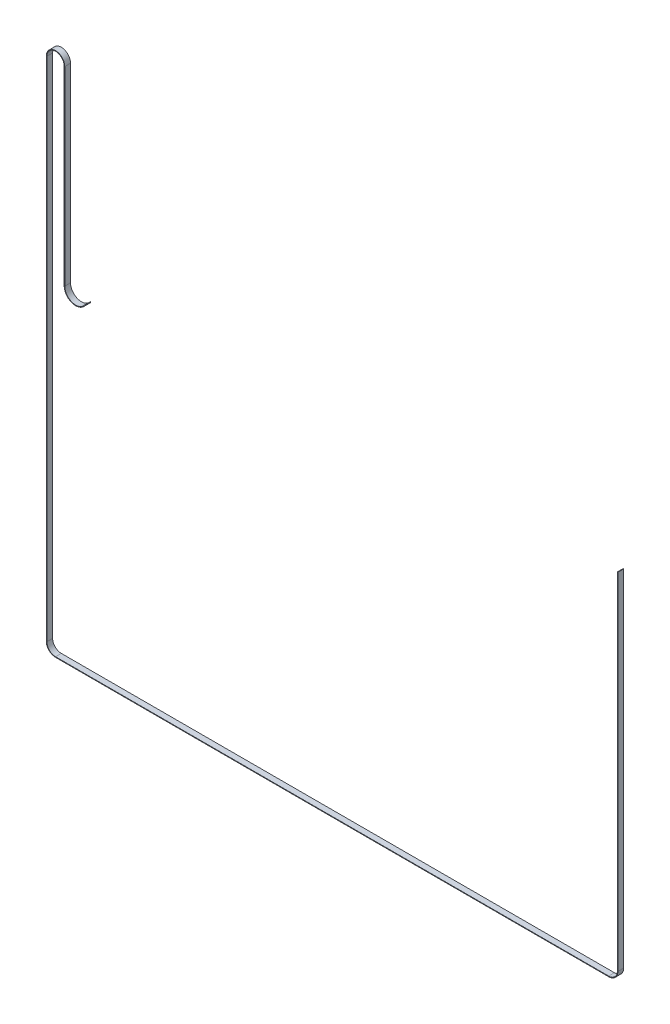
ISO-10303-21;
HEADER;
FILE_DESCRIPTION(('STEP AP214'),'2;1');
FILE_NAME('part.step','',(''),(''),'','','');
FILE_SCHEMA(('AUTOMOTIVE_DESIGN { 1 0 10303 214 1 1 1 1 }'));
ENDSEC;
DATA;
#1=APPLICATION_CONTEXT('core data for automotive mechanical design processes');
#2=APPLICATION_PROTOCOL_DEFINITION('international standard','automotive_design',2000,#1);
#3=PRODUCT_CONTEXT('',#1,'mechanical');
#4=PRODUCT('Part','Part','',(#3));
#5=PRODUCT_RELATED_PRODUCT_CATEGORY('part','',(#4));
#6=PRODUCT_DEFINITION_FORMATION('','',#4);
#7=PRODUCT_DEFINITION_CONTEXT('part definition',#1,'design');
#8=PRODUCT_DEFINITION('design','',#6,#7);
#9=PRODUCT_DEFINITION_SHAPE('','',#8);
#10=(LENGTH_UNIT() NAMED_UNIT(*) SI_UNIT(.MILLI.,.METRE.));
#11=(NAMED_UNIT(*) PLANE_ANGLE_UNIT() SI_UNIT($,.RADIAN.));
#12=(NAMED_UNIT(*) SI_UNIT($,.STERADIAN.) SOLID_ANGLE_UNIT());
#13=UNCERTAINTY_MEASURE_WITH_UNIT(LENGTH_MEASURE(1.E-05),#10,'distance_accuracy_value','');
#14=(GEOMETRIC_REPRESENTATION_CONTEXT(3) GLOBAL_UNCERTAINTY_ASSIGNED_CONTEXT((#13)) GLOBAL_UNIT_ASSIGNED_CONTEXT((#10,
#11,#12)) REPRESENTATION_CONTEXT('',''));
#15=CARTESIAN_POINT('',(0.,0.,0.));
#16=DIRECTION('',(0.,0.,1.));
#17=DIRECTION('',(1.,0.,0.));
#18=AXIS2_PLACEMENT_3D('',#15,#16,#17);
#19=CARTESIAN_POINT('',(-222.5,275.,2.5));
#20=DIRECTION('',(0.,0.,-1.));
#21=DIRECTION('',(-1.,0.,0.));
#22=AXIS2_PLACEMENT_3D('',#19,#20,#21);
#23=CYLINDRICAL_SURFACE('',#22,9.99999999999976);
#24=CARTESIAN_POINT('',(-222.5,275.,-2.5));
#25=DIRECTION('',(0.,0.,1.));
#26=DIRECTION('',(1.,0.,0.));
#27=AXIS2_PLACEMENT_3D('',#24,#25,#26);
#28=CIRCLE('',#27,9.99999999999976);
#29=CARTESIAN_POINT('',(-232.5,275.,-2.5));
#30=VERTEX_POINT('',#29);
#31=CARTESIAN_POINT('',(-214.437599566756,269.084114668621,-2.5));
#32=VERTEX_POINT('',#31);
#33=EDGE_CURVE('E190',#30,#32,#28,.T.);
#34=ORIENTED_EDGE('',*,*,#33,.T.);
#35=DIRECTION('',(0.,0.,-1.));
#36=VECTOR('',#35,1.);
#37=CARTESIAN_POINT('',(-214.437599566756,269.084114668621,2.5));
#38=LINE('',#37,#36);
#39=CARTESIAN_POINT('',(-214.437599566756,269.084114668621,2.5));
#40=VERTEX_POINT('',#39);
#41=EDGE_CURVE('E11',#40,#32,#38,.T.);
#42=ORIENTED_EDGE('',*,*,#41,.F.);
#43=CARTESIAN_POINT('',(-222.5,275.,2.5));
#44=DIRECTION('',(0.,0.,1.));
#45=DIRECTION('',(1.,0.,0.));
#46=AXIS2_PLACEMENT_3D('',#43,#44,#45);
#47=CIRCLE('',#46,9.99999999999976);
#48=CARTESIAN_POINT('',(-232.5,275.,2.5));
#49=VERTEX_POINT('',#48);
#50=EDGE_CURVE('E121',#49,#40,#47,.T.);
#51=ORIENTED_EDGE('',*,*,#50,.F.);
#52=DIRECTION('',(0.,0.,-1.));
#53=VECTOR('',#52,1.);
#54=CARTESIAN_POINT('',(-232.5,275.,2.5));
#55=LINE('',#54,#53);
#56=EDGE_CURVE('E186',#49,#30,#55,.T.);
#57=ORIENTED_EDGE('',*,*,#56,.T.);
#58=EDGE_LOOP('',(#34,#42,#51,#57));
#59=FACE_BOUND('',#58,.T.);
#60=ADVANCED_FACE('F35',(#59),#23,.T.);
#61=CARTESIAN_POINT('',(-214.840719588419,269.37990893519,2.5));
#62=DIRECTION('',(0.591588533137898,0.806240043324412,0.));
#63=DIRECTION('',(-0.806240043324412,0.591588533137898,0.));
#64=AXIS2_PLACEMENT_3D('',#61,#62,#63);
#65=PLANE('',#64);
#66=DIRECTION('',(0.806240043324412,-0.591588533137898,0.));
#67=VECTOR('',#66,1.);
#68=CARTESIAN_POINT('',(-214.840719588419,269.37990893519,-2.5));
#69=LINE('',#68,#67);
#70=CARTESIAN_POINT('',(-214.840719588419,269.37990893519,-2.5));
#71=VERTEX_POINT('',#70);
#72=EDGE_CURVE('E193',#71,#32,#69,.T.);
#73=ORIENTED_EDGE('',*,*,#72,.F.);
#74=DIRECTION('',(0.,0.,-1.));
#75=VECTOR('',#74,1.);
#76=CARTESIAN_POINT('',(-214.840719588419,269.37990893519,2.5));
#77=LINE('',#76,#75);
#78=CARTESIAN_POINT('',(-214.840719588419,269.37990893519,2.5));
#79=VERTEX_POINT('',#78);
#80=EDGE_CURVE('E43',#79,#71,#77,.T.);
#81=ORIENTED_EDGE('',*,*,#80,.F.);
#82=DIRECTION('',(0.806240043324412,-0.591588533137898,0.));
#83=VECTOR('',#82,1.);
#84=CARTESIAN_POINT('',(-214.840719588419,269.37990893519,2.5));
#85=LINE('',#84,#83);
#86=EDGE_CURVE('E285',#79,#40,#85,.T.);
#87=ORIENTED_EDGE('',*,*,#86,.T.);
#88=ORIENTED_EDGE('',*,*,#41,.T.);
#89=EDGE_LOOP('',(#73,#81,#87,#88));
#90=FACE_BOUND('',#89,.T.);
#91=ADVANCED_FACE('F272',(#90),#65,.T.);
#92=CARTESIAN_POINT('',(-222.5,275.,2.5));
#93=DIRECTION('',(0.,0.,-1.));
#94=DIRECTION('',(-1.,0.,0.));
#95=AXIS2_PLACEMENT_3D('',#92,#93,#94);
#96=CYLINDRICAL_SURFACE('',#95,9.49999999999976);
#97=CARTESIAN_POINT('',(-222.5,275.,-2.5));
#98=DIRECTION('',(0.,0.,1.));
#99=DIRECTION('',(1.,0.,0.));
#100=AXIS2_PLACEMENT_3D('',#97,#98,#99);
#101=CIRCLE('',#100,9.49999999999976);
#102=CARTESIAN_POINT('',(-232.,275.,-2.5));
#103=VERTEX_POINT('',#102);
#104=EDGE_CURVE('E196',#103,#71,#101,.T.);
#105=ORIENTED_EDGE('',*,*,#104,.F.);
#106=DIRECTION('',(0.,0.,-1.));
#107=VECTOR('',#106,1.);
#108=CARTESIAN_POINT('',(-232.,275.,2.5));
#109=LINE('',#108,#107);
#110=CARTESIAN_POINT('',(-232.,275.,2.5));
#111=VERTEX_POINT('',#110);
#112=EDGE_CURVE('E262',#111,#103,#109,.T.);
#113=ORIENTED_EDGE('',*,*,#112,.F.);
#114=CARTESIAN_POINT('',(-222.5,275.,2.5));
#115=DIRECTION('',(0.,0.,1.));
#116=DIRECTION('',(1.,0.,0.));
#117=AXIS2_PLACEMENT_3D('',#114,#115,#116);
#118=CIRCLE('',#117,9.49999999999976);
#119=EDGE_CURVE('E269',#111,#79,#118,.T.);
#120=ORIENTED_EDGE('',*,*,#119,.T.);
#121=ORIENTED_EDGE('',*,*,#80,.T.);
#122=EDGE_LOOP('',(#105,#113,#120,#121));
#123=FACE_BOUND('',#122,.T.);
#124=ADVANCED_FACE('F267',(#123),#96,.F.);
#125=CARTESIAN_POINT('',(-232.,440.,2.5));
#126=DIRECTION('',(1.,0.,0.));
#127=DIRECTION('',(0.,1.,0.));
#128=AXIS2_PLACEMENT_3D('',#125,#126,#127);
#129=PLANE('',#128);
#130=DIRECTION('',(0.,-1.,0.));
#131=VECTOR('',#130,1.);
#132=CARTESIAN_POINT('',(-232.,440.,-2.5));
#133=LINE('',#132,#131);
#134=CARTESIAN_POINT('',(-232.,440.,-2.5));
#135=VERTEX_POINT('',#134);
#136=EDGE_CURVE('E199',#135,#103,#133,.T.);
#137=ORIENTED_EDGE('',*,*,#136,.F.);
#138=DIRECTION('',(0.,0.,-1.));
#139=VECTOR('',#138,1.);
#140=CARTESIAN_POINT('',(-232.,440.,2.5));
#141=LINE('',#140,#139);
#142=CARTESIAN_POINT('',(-232.,440.,2.5));
#143=VERTEX_POINT('',#142);
#144=EDGE_CURVE('E260',#143,#135,#141,.T.);
#145=ORIENTED_EDGE('',*,*,#144,.F.);
#146=DIRECTION('',(0.,-1.,0.));
#147=VECTOR('',#146,1.);
#148=CARTESIAN_POINT('',(-232.,440.,2.5));
#149=LINE('',#148,#147);
#150=EDGE_CURVE('E282',#143,#111,#149,.T.);
#151=ORIENTED_EDGE('',*,*,#150,.T.);
#152=ORIENTED_EDGE('',*,*,#112,.T.);
#153=EDGE_LOOP('',(#137,#145,#151,#152));
#154=FACE_BOUND('',#153,.T.);
#155=ADVANCED_FACE('F279',(#154),#129,.T.);
#156=CARTESIAN_POINT('',(-240.,440.,2.5));
#157=DIRECTION('',(0.,0.,-1.));
#158=DIRECTION('',(-1.,0.,0.));
#159=AXIS2_PLACEMENT_3D('',#156,#157,#158);
#160=CYLINDRICAL_SURFACE('',#159,8.00000000000001);
#161=CARTESIAN_POINT('',(-240.,440.,-2.5));
#162=DIRECTION('',(0.,0.,1.));
#163=DIRECTION('',(1.,0.,0.));
#164=AXIS2_PLACEMENT_3D('',#161,#162,#163);
#165=CIRCLE('',#164,8.00000000000001);
#166=CARTESIAN_POINT('',(-248.,440.,-2.5));
#167=VERTEX_POINT('',#166);
#168=EDGE_CURVE('E202',#167,#135,#165,.F.);
#169=ORIENTED_EDGE('',*,*,#168,.F.);
#170=DIRECTION('',(0.,0.,-1.));
#171=VECTOR('',#170,1.);
#172=CARTESIAN_POINT('',(-248.,440.,2.5));
#173=LINE('',#172,#171);
#174=CARTESIAN_POINT('',(-248.,440.,2.5));
#175=VERTEX_POINT('',#174);
#176=EDGE_CURVE('E258',#175,#167,#173,.T.);
#177=ORIENTED_EDGE('',*,*,#176,.F.);
#178=CARTESIAN_POINT('',(-240.,440.,2.5));
#179=DIRECTION('',(0.,0.,1.));
#180=DIRECTION('',(1.,0.,0.));
#181=AXIS2_PLACEMENT_3D('',#178,#179,#180);
#182=CIRCLE('',#181,8.00000000000001);
#183=EDGE_CURVE('E287',#175,#143,#182,.F.);
#184=ORIENTED_EDGE('',*,*,#183,.T.);
#185=ORIENTED_EDGE('',*,*,#144,.T.);
#186=EDGE_LOOP('',(#169,#177,#184,#185));
#187=FACE_BOUND('',#186,.T.);
#188=ADVANCED_FACE('F348',(#187),#160,.T.);
#189=CARTESIAN_POINT('',(-248.,0.,2.5));
#190=DIRECTION('',(-1.,0.,0.));
#191=DIRECTION('',(0.,0.,1.));
#192=AXIS2_PLACEMENT_3D('',#189,#190,#191);
#193=PLANE('',#192);
#194=DIRECTION('',(0.,1.,0.));
#195=VECTOR('',#194,1.);
#196=CARTESIAN_POINT('',(-248.,0.,-2.5));
#197=LINE('',#196,#195);
#198=CARTESIAN_POINT('',(-248.,0.,-2.5));
#199=VERTEX_POINT('',#198);
#200=EDGE_CURVE('E205',#199,#167,#197,.T.);
#201=ORIENTED_EDGE('',*,*,#200,.F.);
#202=DIRECTION('',(0.,0.,-1.));
#203=VECTOR('',#202,1.);
#204=CARTESIAN_POINT('',(-248.,0.,2.5));
#205=LINE('',#204,#203);
#206=CARTESIAN_POINT('',(-248.,0.,2.5));
#207=VERTEX_POINT('',#206);
#208=EDGE_CURVE('E256',#207,#199,#205,.T.);
#209=ORIENTED_EDGE('',*,*,#208,.F.);
#210=DIRECTION('',(0.,1.,0.));
#211=VECTOR('',#210,1.);
#212=CARTESIAN_POINT('',(-248.,0.,2.5));
#213=LINE('',#212,#211);
#214=EDGE_CURVE('E293',#207,#175,#213,.T.);
#215=ORIENTED_EDGE('',*,*,#214,.T.);
#216=ORIENTED_EDGE('',*,*,#176,.T.);
#217=EDGE_LOOP('',(#201,#209,#215,#216));
#218=FACE_BOUND('',#217,.T.);
#219=ADVANCED_FACE('F351',(#218),#193,.T.);
#220=CARTESIAN_POINT('',(-240.,0.,2.5));
#221=DIRECTION('',(0.,0.,-1.));
#222=DIRECTION('',(-1.,0.,0.));
#223=AXIS2_PLACEMENT_3D('',#220,#221,#222);
#224=CYLINDRICAL_SURFACE('',#223,8.);
#225=CARTESIAN_POINT('',(-240.,0.,-2.5));
#226=DIRECTION('',(0.,0.,1.));
#227=DIRECTION('',(1.,0.,0.));
#228=AXIS2_PLACEMENT_3D('',#225,#226,#227);
#229=CIRCLE('',#228,8.);
#230=CARTESIAN_POINT('',(-240.,-8.00000000000002,-2.5));
#231=VERTEX_POINT('',#230);
#232=EDGE_CURVE('E208',#231,#199,#229,.F.);
#233=ORIENTED_EDGE('',*,*,#232,.F.);
#234=DIRECTION('',(0.,0.,-1.));
#235=VECTOR('',#234,1.);
#236=CARTESIAN_POINT('',(-240.,-8.00000000000002,2.5));
#237=LINE('',#236,#235);
#238=CARTESIAN_POINT('',(-240.,-8.00000000000002,2.5));
#239=VERTEX_POINT('',#238);
#240=EDGE_CURVE('E254',#239,#231,#237,.T.);
#241=ORIENTED_EDGE('',*,*,#240,.F.);
#242=CARTESIAN_POINT('',(-240.,0.,2.5));
#243=DIRECTION('',(0.,0.,1.));
#244=DIRECTION('',(1.,0.,0.));
#245=AXIS2_PLACEMENT_3D('',#242,#243,#244);
#246=CIRCLE('',#245,8.);
#247=EDGE_CURVE('E296',#239,#207,#246,.F.);
#248=ORIENTED_EDGE('',*,*,#247,.T.);
#249=ORIENTED_EDGE('',*,*,#208,.T.);
#250=EDGE_LOOP('',(#233,#241,#248,#249));
#251=FACE_BOUND('',#250,.T.);
#252=ADVANCED_FACE('F355',(#251),#224,.T.);
#253=CARTESIAN_POINT('',(240.,-8.00000000000001,2.5));
#254=DIRECTION('',(0.,-1.,0.));
#255=DIRECTION('',(0.,0.,-1.));
#256=AXIS2_PLACEMENT_3D('',#253,#254,#255);
#257=PLANE('',#256);
#258=DIRECTION('',(1.,0.,0.));
#259=VECTOR('',#258,1.);
#260=CARTESIAN_POINT('',(240.,-8.00000000000001,-2.5));
#261=LINE('',#260,#259);
#262=CARTESIAN_POINT('',(240.,-8.00000000000001,-2.5));
#263=VERTEX_POINT('',#262);
#264=EDGE_CURVE('E211',#263,#231,#261,.F.);
#265=ORIENTED_EDGE('',*,*,#264,.F.);
#266=DIRECTION('',(0.,0.,-1.));
#267=VECTOR('',#266,1.);
#268=CARTESIAN_POINT('',(240.,-8.00000000000001,2.5));
#269=LINE('',#268,#267);
#270=CARTESIAN_POINT('',(240.,-8.00000000000001,2.5));
#271=VERTEX_POINT('',#270);
#272=EDGE_CURVE('E252',#271,#263,#269,.T.);
#273=ORIENTED_EDGE('',*,*,#272,.F.);
#274=DIRECTION('',(1.,0.,0.));
#275=VECTOR('',#274,1.);
#276=CARTESIAN_POINT('',(240.,-8.00000000000001,2.5));
#277=LINE('',#276,#275);
#278=EDGE_CURVE('E299',#271,#239,#277,.F.);
#279=ORIENTED_EDGE('',*,*,#278,.T.);
#280=ORIENTED_EDGE('',*,*,#240,.T.);
#281=EDGE_LOOP('',(#265,#273,#279,#280));
#282=FACE_BOUND('',#281,.T.);
#283=ADVANCED_FACE('F359',(#282),#257,.T.);
#284=CARTESIAN_POINT('',(240.,0.,2.5));
#285=DIRECTION('',(0.,0.,-1.));
#286=DIRECTION('',(-1.,0.,0.));
#287=AXIS2_PLACEMENT_3D('',#284,#285,#286);
#288=CYLINDRICAL_SURFACE('',#287,8.00000000000004);
#289=CARTESIAN_POINT('',(240.,0.,-2.5));
#290=DIRECTION('',(0.,0.,1.));
#291=DIRECTION('',(1.,0.,0.));
#292=AXIS2_PLACEMENT_3D('',#289,#290,#291);
#293=CIRCLE('',#292,8.00000000000004);
#294=CARTESIAN_POINT('',(248.,0.,-2.5));
#295=VERTEX_POINT('',#294);
#296=EDGE_CURVE('E214',#295,#263,#293,.F.);
#297=ORIENTED_EDGE('',*,*,#296,.F.);
#298=DIRECTION('',(0.,0.,-1.));
#299=VECTOR('',#298,1.);
#300=CARTESIAN_POINT('',(248.,0.,2.5));
#301=LINE('',#300,#299);
#302=CARTESIAN_POINT('',(248.,0.,2.5));
#303=VERTEX_POINT('',#302);
#304=EDGE_CURVE('E250',#303,#295,#301,.T.);
#305=ORIENTED_EDGE('',*,*,#304,.F.);
#306=CARTESIAN_POINT('',(240.,0.,2.5));
#307=DIRECTION('',(0.,0.,1.));
#308=DIRECTION('',(1.,0.,0.));
#309=AXIS2_PLACEMENT_3D('',#306,#307,#308);
#310=CIRCLE('',#309,8.00000000000004);
#311=EDGE_CURVE('E302',#303,#271,#310,.F.);
#312=ORIENTED_EDGE('',*,*,#311,.T.);
#313=ORIENTED_EDGE('',*,*,#272,.T.);
#314=EDGE_LOOP('',(#297,#305,#312,#313));
#315=FACE_BOUND('',#314,.T.);
#316=ADVANCED_FACE('F363',(#315),#288,.T.);
#317=CARTESIAN_POINT('',(248.,0.,2.5));
#318=DIRECTION('',(1.,0.,0.));
#319=DIRECTION('',(0.,0.,-1.));
#320=AXIS2_PLACEMENT_3D('',#317,#318,#319);
#321=PLANE('',#320);
#322=DIRECTION('',(0.,1.,0.));
#323=VECTOR('',#322,1.);
#324=CARTESIAN_POINT('',(248.,0.,-2.5));
#325=LINE('',#324,#323);
#326=CARTESIAN_POINT('',(248.,300.,-2.5));
#327=VERTEX_POINT('',#326);
#328=EDGE_CURVE('E217',#327,#295,#325,.F.);
#329=ORIENTED_EDGE('',*,*,#328,.F.);
#330=DIRECTION('',(0.,0.,-1.));
#331=VECTOR('',#330,1.);
#332=CARTESIAN_POINT('',(248.,300.,2.5));
#333=LINE('',#332,#331);
#334=CARTESIAN_POINT('',(248.,300.,2.5));
#335=VERTEX_POINT('',#334);
#336=EDGE_CURVE('E248',#335,#327,#333,.T.);
#337=ORIENTED_EDGE('',*,*,#336,.F.);
#338=DIRECTION('',(0.,1.,0.));
#339=VECTOR('',#338,1.);
#340=CARTESIAN_POINT('',(248.,0.,2.5));
#341=LINE('',#340,#339);
#342=EDGE_CURVE('E305',#335,#303,#341,.F.);
#343=ORIENTED_EDGE('',*,*,#342,.T.);
#344=ORIENTED_EDGE('',*,*,#304,.T.);
#345=EDGE_LOOP('',(#329,#337,#343,#344));
#346=FACE_BOUND('',#345,.T.);
#347=ADVANCED_FACE('F367',(#346),#321,.T.);
#348=CARTESIAN_POINT('',(247.5,300.,2.5));
#349=DIRECTION('',(0.,1.,0.));
#350=DIRECTION('',(0.,0.,1.));
#351=AXIS2_PLACEMENT_3D('',#348,#349,#350);
#352=PLANE('',#351);
#353=DIRECTION('',(1.,0.,0.));
#354=VECTOR('',#353,1.);
#355=CARTESIAN_POINT('',(247.5,300.,-2.5));
#356=LINE('',#355,#354);
#357=CARTESIAN_POINT('',(247.5,300.,-2.5));
#358=VERTEX_POINT('',#357);
#359=EDGE_CURVE('E220',#358,#327,#356,.T.);
#360=ORIENTED_EDGE('',*,*,#359,.F.);
#361=DIRECTION('',(0.,0.,-1.));
#362=VECTOR('',#361,1.);
#363=CARTESIAN_POINT('',(247.5,300.,2.5));
#364=LINE('',#363,#362);
#365=CARTESIAN_POINT('',(247.5,300.,2.5));
#366=VERTEX_POINT('',#365);
#367=EDGE_CURVE('E246',#366,#358,#364,.T.);
#368=ORIENTED_EDGE('',*,*,#367,.F.);
#369=DIRECTION('',(1.,0.,0.));
#370=VECTOR('',#369,1.);
#371=CARTESIAN_POINT('',(247.5,300.,2.5));
#372=LINE('',#371,#370);
#373=EDGE_CURVE('E308',#366,#335,#372,.T.);
#374=ORIENTED_EDGE('',*,*,#373,.T.);
#375=ORIENTED_EDGE('',*,*,#336,.T.);
#376=EDGE_LOOP('',(#360,#368,#374,#375));
#377=FACE_BOUND('',#376,.T.);
#378=ADVANCED_FACE('F371',(#377),#352,.T.);
#379=CARTESIAN_POINT('',(247.5,0.,2.5));
#380=DIRECTION('',(1.,0.,0.));
#381=DIRECTION('',(0.,0.,-1.));
#382=AXIS2_PLACEMENT_3D('',#379,#380,#381);
#383=PLANE('',#382);
#384=DIRECTION('',(0.,-1.,0.));
#385=VECTOR('',#384,1.);
#386=CARTESIAN_POINT('',(247.5,0.,-2.5));
#387=LINE('',#386,#385);
#388=CARTESIAN_POINT('',(247.5,0.,-2.5));
#389=VERTEX_POINT('',#388);
#390=EDGE_CURVE('E223',#358,#389,#387,.T.);
#391=ORIENTED_EDGE('',*,*,#390,.T.);
#392=DIRECTION('',(0.,0.,-1.));
#393=VECTOR('',#392,1.);
#394=CARTESIAN_POINT('',(247.5,0.,2.5));
#395=LINE('',#394,#393);
#396=CARTESIAN_POINT('',(247.5,0.,2.5));
#397=VERTEX_POINT('',#396);
#398=EDGE_CURVE('E243',#397,#389,#395,.T.);
#399=ORIENTED_EDGE('',*,*,#398,.F.);
#400=DIRECTION('',(0.,-1.,0.));
#401=VECTOR('',#400,1.);
#402=CARTESIAN_POINT('',(247.5,0.,2.5));
#403=LINE('',#402,#401);
#404=EDGE_CURVE('E311',#366,#397,#403,.T.);
#405=ORIENTED_EDGE('',*,*,#404,.F.);
#406=ORIENTED_EDGE('',*,*,#367,.T.);
#407=EDGE_LOOP('',(#391,#399,#405,#406));
#408=FACE_BOUND('',#407,.T.);
#409=ADVANCED_FACE('F375',(#408),#383,.F.);
#410=CARTESIAN_POINT('',(240.,0.,2.5));
#411=DIRECTION('',(0.,0.,-1.));
#412=DIRECTION('',(-1.,0.,0.));
#413=AXIS2_PLACEMENT_3D('',#410,#411,#412);
#414=CYLINDRICAL_SURFACE('',#413,7.50000000000004);
#415=CARTESIAN_POINT('',(240.,0.,-2.5));
#416=DIRECTION('',(0.,0.,-1.));
#417=DIRECTION('',(-1.,0.,0.));
#418=AXIS2_PLACEMENT_3D('',#415,#416,#417);
#419=CIRCLE('',#418,7.50000000000004);
#420=CARTESIAN_POINT('',(240.,-7.50000000000001,-2.5));
#421=VERTEX_POINT('',#420);
#422=EDGE_CURVE('E225',#389,#421,#419,.T.);
#423=ORIENTED_EDGE('',*,*,#422,.T.);
#424=DIRECTION('',(0.,0.,-1.));
#425=VECTOR('',#424,1.);
#426=CARTESIAN_POINT('',(240.,-7.50000000000001,2.5));
#427=LINE('',#426,#425);
#428=CARTESIAN_POINT('',(240.,-7.50000000000001,2.5));
#429=VERTEX_POINT('',#428);
#430=EDGE_CURVE('E240',#429,#421,#427,.T.);
#431=ORIENTED_EDGE('',*,*,#430,.F.);
#432=CARTESIAN_POINT('',(240.,0.,2.5));
#433=DIRECTION('',(0.,0.,-1.));
#434=DIRECTION('',(-1.,0.,0.));
#435=AXIS2_PLACEMENT_3D('',#432,#433,#434);
#436=CIRCLE('',#435,7.50000000000004);
#437=EDGE_CURVE('E313',#397,#429,#436,.T.);
#438=ORIENTED_EDGE('',*,*,#437,.F.);
#439=ORIENTED_EDGE('',*,*,#398,.T.);
#440=EDGE_LOOP('',(#423,#431,#438,#439));
#441=FACE_BOUND('',#440,.T.);
#442=ADVANCED_FACE('F379',(#441),#414,.F.);
#443=CARTESIAN_POINT('',(240.,-7.50000000000001,2.5));
#444=DIRECTION('',(0.,-1.,0.));
#445=DIRECTION('',(0.,0.,-1.));
#446=AXIS2_PLACEMENT_3D('',#443,#444,#445);
#447=PLANE('',#446);
#448=DIRECTION('',(-1.,0.,0.));
#449=VECTOR('',#448,1.);
#450=CARTESIAN_POINT('',(240.,-7.50000000000001,-2.5));
#451=LINE('',#450,#449);
#452=CARTESIAN_POINT('',(-240.,-7.50000000000001,-2.5));
#453=VERTEX_POINT('',#452);
#454=EDGE_CURVE('E227',#421,#453,#451,.T.);
#455=ORIENTED_EDGE('',*,*,#454,.T.);
#456=DIRECTION('',(0.,0.,-1.));
#457=VECTOR('',#456,1.);
#458=CARTESIAN_POINT('',(-240.,-7.50000000000001,2.5));
#459=LINE('',#458,#457);
#460=CARTESIAN_POINT('',(-240.,-7.50000000000001,2.5));
#461=VERTEX_POINT('',#460);
#462=EDGE_CURVE('E237',#461,#453,#459,.T.);
#463=ORIENTED_EDGE('',*,*,#462,.F.);
#464=DIRECTION('',(-1.,0.,0.));
#465=VECTOR('',#464,1.);
#466=CARTESIAN_POINT('',(240.,-7.50000000000001,2.5));
#467=LINE('',#466,#465);
#468=EDGE_CURVE('E315',#429,#461,#467,.T.);
#469=ORIENTED_EDGE('',*,*,#468,.F.);
#470=ORIENTED_EDGE('',*,*,#430,.T.);
#471=EDGE_LOOP('',(#455,#463,#469,#470));
#472=FACE_BOUND('',#471,.T.);
#473=ADVANCED_FACE('F321',(#472),#447,.F.);
#474=CARTESIAN_POINT('',(-240.,0.,2.5));
#475=DIRECTION('',(0.,0.,-1.));
#476=DIRECTION('',(-1.,0.,0.));
#477=AXIS2_PLACEMENT_3D('',#474,#475,#476);
#478=CYLINDRICAL_SURFACE('',#477,7.5);
#479=CARTESIAN_POINT('',(-240.,0.,-2.5));
#480=DIRECTION('',(0.,0.,-1.));
#481=DIRECTION('',(1.,0.,0.));
#482=AXIS2_PLACEMENT_3D('',#479,#480,#481);
#483=CIRCLE('',#482,7.5);
#484=CARTESIAN_POINT('',(-247.5,0.,-2.5));
#485=VERTEX_POINT('',#484);
#486=EDGE_CURVE('E229',#453,#485,#483,.T.);
#487=ORIENTED_EDGE('',*,*,#486,.T.);
#488=DIRECTION('',(0.,0.,-1.));
#489=VECTOR('',#488,1.);
#490=CARTESIAN_POINT('',(-247.5,0.,2.5));
#491=LINE('',#490,#489);
#492=CARTESIAN_POINT('',(-247.5,0.,2.5));
#493=VERTEX_POINT('',#492);
#494=EDGE_CURVE('E181',#493,#485,#491,.T.);
#495=ORIENTED_EDGE('',*,*,#494,.F.);
#496=CARTESIAN_POINT('',(-240.,0.,2.5));
#497=DIRECTION('',(0.,0.,-1.));
#498=DIRECTION('',(1.,0.,0.));
#499=AXIS2_PLACEMENT_3D('',#496,#497,#498);
#500=CIRCLE('',#499,7.5);
#501=EDGE_CURVE('E172',#461,#493,#500,.T.);
#502=ORIENTED_EDGE('',*,*,#501,.F.);
#503=ORIENTED_EDGE('',*,*,#462,.T.);
#504=EDGE_LOOP('',(#487,#495,#502,#503));
#505=FACE_BOUND('',#504,.T.);
#506=ADVANCED_FACE('F325',(#505),#478,.F.);
#507=CARTESIAN_POINT('',(-247.5,0.,2.5));
#508=DIRECTION('',(-1.,0.,0.));
#509=DIRECTION('',(0.,0.,1.));
#510=AXIS2_PLACEMENT_3D('',#507,#508,#509);
#511=PLANE('',#510);
#512=DIRECTION('',(0.,1.,0.));
#513=VECTOR('',#512,1.);
#514=CARTESIAN_POINT('',(-247.5,0.,-2.5));
#515=LINE('',#514,#513);
#516=CARTESIAN_POINT('',(-247.5,440.,-2.5));
#517=VERTEX_POINT('',#516);
#518=EDGE_CURVE('E180',#485,#517,#515,.T.);
#519=ORIENTED_EDGE('',*,*,#518,.T.);
#520=DIRECTION('',(0.,0.,-1.));
#521=VECTOR('',#520,1.);
#522=CARTESIAN_POINT('',(-247.5,440.,2.5));
#523=LINE('',#522,#521);
#524=CARTESIAN_POINT('',(-247.5,440.,2.5));
#525=VERTEX_POINT('',#524);
#526=EDGE_CURVE('E177',#525,#517,#523,.T.);
#527=ORIENTED_EDGE('',*,*,#526,.F.);
#528=DIRECTION('',(0.,1.,0.));
#529=VECTOR('',#528,1.);
#530=CARTESIAN_POINT('',(-247.5,0.,2.5));
#531=LINE('',#530,#529);
#532=EDGE_CURVE('E166',#493,#525,#531,.T.);
#533=ORIENTED_EDGE('',*,*,#532,.F.);
#534=ORIENTED_EDGE('',*,*,#494,.T.);
#535=EDGE_LOOP('',(#519,#527,#533,#534));
#536=FACE_BOUND('',#535,.T.);
#537=ADVANCED_FACE('F178',(#536),#511,.F.);
#538=CARTESIAN_POINT('',(-240.,440.,2.5));
#539=DIRECTION('',(0.,0.,-1.));
#540=DIRECTION('',(-1.,0.,0.));
#541=AXIS2_PLACEMENT_3D('',#538,#539,#540);
#542=CYLINDRICAL_SURFACE('',#541,7.50000000000001);
#543=CARTESIAN_POINT('',(-240.,440.,-2.5));
#544=DIRECTION('',(0.,0.,-1.));
#545=DIRECTION('',(1.,0.,0.));
#546=AXIS2_PLACEMENT_3D('',#543,#544,#545);
#547=CIRCLE('',#546,7.50000000000001);
#548=CARTESIAN_POINT('',(-232.5,440.,-2.5));
#549=VERTEX_POINT('',#548);
#550=EDGE_CURVE('E109',#517,#549,#547,.T.);
#551=ORIENTED_EDGE('',*,*,#550,.T.);
#552=DIRECTION('',(0.,0.,-1.));
#553=VECTOR('',#552,1.);
#554=CARTESIAN_POINT('',(-232.5,440.,2.5));
#555=LINE('',#554,#553);
#556=CARTESIAN_POINT('',(-232.5,440.,2.5));
#557=VERTEX_POINT('',#556);
#558=EDGE_CURVE('E182',#557,#549,#555,.T.);
#559=ORIENTED_EDGE('',*,*,#558,.F.);
#560=CARTESIAN_POINT('',(-240.,440.,2.5));
#561=DIRECTION('',(0.,0.,-1.));
#562=DIRECTION('',(1.,0.,0.));
#563=AXIS2_PLACEMENT_3D('',#560,#561,#562);
#564=CIRCLE('',#563,7.50000000000001);
#565=EDGE_CURVE('E170',#525,#557,#564,.T.);
#566=ORIENTED_EDGE('',*,*,#565,.F.);
#567=ORIENTED_EDGE('',*,*,#526,.T.);
#568=EDGE_LOOP('',(#551,#559,#566,#567));
#569=FACE_BOUND('',#568,.T.);
#570=ADVANCED_FACE('F184',(#569),#542,.F.);
#571=CARTESIAN_POINT('',(-232.5,440.,2.5));
#572=DIRECTION('',(1.,0.,0.));
#573=DIRECTION('',(0.,1.,0.));
#574=AXIS2_PLACEMENT_3D('',#571,#572,#573);
#575=PLANE('',#574);
#576=DIRECTION('',(0.,-1.,0.));
#577=VECTOR('',#576,1.);
#578=CARTESIAN_POINT('',(-232.5,440.,-2.5));
#579=LINE('',#578,#577);
#580=EDGE_CURVE('E115',#549,#30,#579,.T.);
#581=ORIENTED_EDGE('',*,*,#580,.T.);
#582=ORIENTED_EDGE('',*,*,#56,.F.);
#583=DIRECTION('',(0.,-1.,0.));
#584=VECTOR('',#583,1.);
#585=CARTESIAN_POINT('',(-232.5,440.,2.5));
#586=LINE('',#585,#584);
#587=EDGE_CURVE('E51',#557,#49,#586,.T.);
#588=ORIENTED_EDGE('',*,*,#587,.F.);
#589=ORIENTED_EDGE('',*,*,#558,.T.);
#590=EDGE_LOOP('',(#581,#582,#588,#589));
#591=FACE_BOUND('',#590,.T.);
#592=ADVANCED_FACE('F327',(#591),#575,.F.);
#593=CARTESIAN_POINT('',(-222.5,275.,2.5));
#594=DIRECTION('',(0.,0.,1.));
#595=DIRECTION('',(1.,0.,0.));
#596=AXIS2_PLACEMENT_3D('',#593,#594,#595);
#597=PLANE('',#596);
#598=ORIENTED_EDGE('',*,*,#50,.T.);
#599=ORIENTED_EDGE('',*,*,#86,.F.);
#600=ORIENTED_EDGE('',*,*,#119,.F.);
#601=ORIENTED_EDGE('',*,*,#150,.F.);
#602=ORIENTED_EDGE('',*,*,#183,.F.);
#603=ORIENTED_EDGE('',*,*,#214,.F.);
#604=ORIENTED_EDGE('',*,*,#247,.F.);
#605=ORIENTED_EDGE('',*,*,#278,.F.);
#606=ORIENTED_EDGE('',*,*,#311,.F.);
#607=ORIENTED_EDGE('',*,*,#342,.F.);
#608=ORIENTED_EDGE('',*,*,#373,.F.);
#609=ORIENTED_EDGE('',*,*,#404,.T.);
#610=ORIENTED_EDGE('',*,*,#437,.T.);
#611=ORIENTED_EDGE('',*,*,#468,.T.);
#612=ORIENTED_EDGE('',*,*,#501,.T.);
#613=ORIENTED_EDGE('',*,*,#532,.T.);
#614=ORIENTED_EDGE('',*,*,#565,.T.);
#615=ORIENTED_EDGE('',*,*,#587,.T.);
#616=EDGE_LOOP('',(#598,#599,#600,#601,#602,#603,#604,#605,#606,#607,#608,#609,#610,#611,#612,
#613,#614,#615));
#617=FACE_BOUND('',#616,.T.);
#618=ADVANCED_FACE('F168',(#617),#597,.T.);
#619=CARTESIAN_POINT('',(-222.5,275.,-2.5));
#620=DIRECTION('',(0.,0.,1.));
#621=DIRECTION('',(1.,0.,0.));
#622=AXIS2_PLACEMENT_3D('',#619,#620,#621);
#623=PLANE('',#622);
#624=ORIENTED_EDGE('',*,*,#33,.F.);
#625=ORIENTED_EDGE('',*,*,#580,.F.);
#626=ORIENTED_EDGE('',*,*,#550,.F.);
#627=ORIENTED_EDGE('',*,*,#518,.F.);
#628=ORIENTED_EDGE('',*,*,#486,.F.);
#629=ORIENTED_EDGE('',*,*,#454,.F.);
#630=ORIENTED_EDGE('',*,*,#422,.F.);
#631=ORIENTED_EDGE('',*,*,#390,.F.);
#632=ORIENTED_EDGE('',*,*,#359,.T.);
#633=ORIENTED_EDGE('',*,*,#328,.T.);
#634=ORIENTED_EDGE('',*,*,#296,.T.);
#635=ORIENTED_EDGE('',*,*,#264,.T.);
#636=ORIENTED_EDGE('',*,*,#232,.T.);
#637=ORIENTED_EDGE('',*,*,#200,.T.);
#638=ORIENTED_EDGE('',*,*,#168,.T.);
#639=ORIENTED_EDGE('',*,*,#136,.T.);
#640=ORIENTED_EDGE('',*,*,#104,.T.);
#641=ORIENTED_EDGE('',*,*,#72,.T.);
#642=EDGE_LOOP('',(#624,#625,#626,#627,#628,#629,#630,#631,#632,#633,#634,#635,#636,#637,#638,
#639,#640,#641));
#643=FACE_BOUND('',#642,.T.);
#644=ADVANCED_FACE('F275',(#643),#623,.F.);
#645=CLOSED_SHELL('',(#60,#91,#124,#155,#188,#219,#252,#283,#316,#347,#378,#409,#442,#473,#506,
#537,#570,#592,#618,#644));
#646=MANIFOLD_SOLID_BREP('B2',#645);
#647=ADVANCED_BREP_SHAPE_REPRESENTATION('',(#18,#646),#14);
#648=SHAPE_DEFINITION_REPRESENTATION(#9,#647);
ENDSEC;
END-ISO-10303-21;
